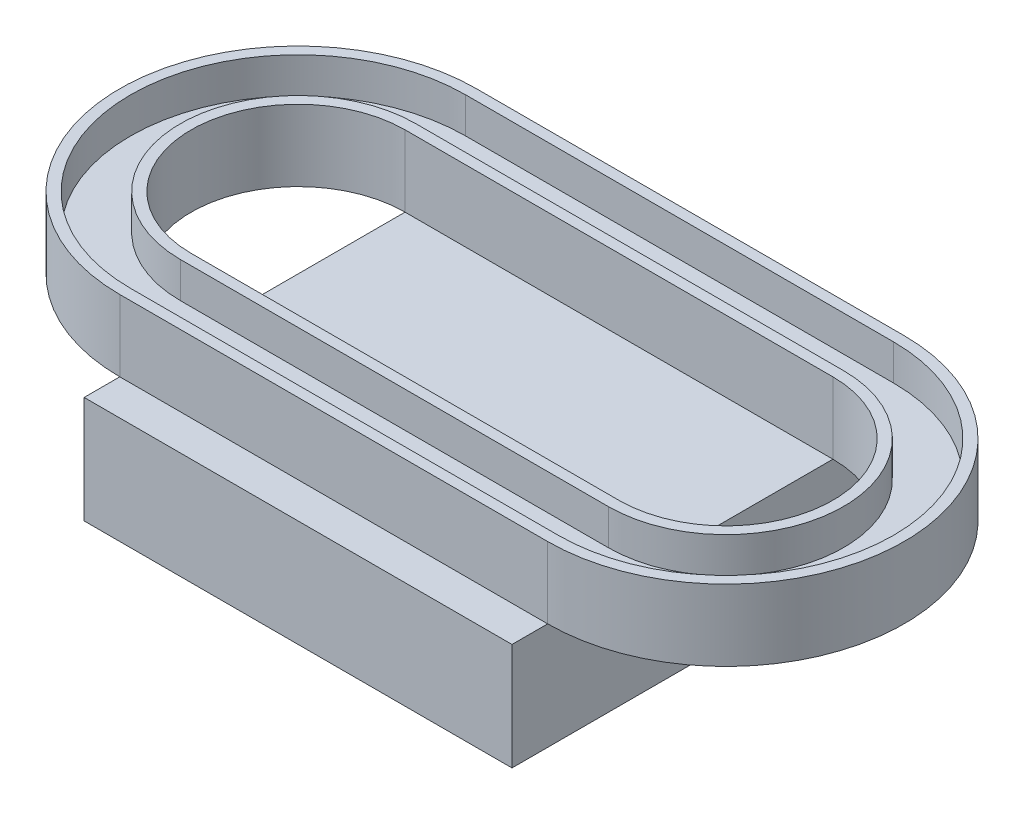
ISO-10303-21;
HEADER;
FILE_DESCRIPTION(('STEP AP214'),'2;1');
FILE_NAME('part.step','',(''),(''),'','','');
FILE_SCHEMA(('AUTOMOTIVE_DESIGN { 1 0 10303 214 1 1 1 1 }'));
ENDSEC;
DATA;
#1=APPLICATION_CONTEXT('core data for automotive mechanical design processes');
#2=APPLICATION_PROTOCOL_DEFINITION('international standard','automotive_design',2000,#1);
#3=PRODUCT_CONTEXT('',#1,'mechanical');
#4=PRODUCT('Part','Part','',(#3));
#5=PRODUCT_RELATED_PRODUCT_CATEGORY('part','',(#4));
#6=PRODUCT_DEFINITION_FORMATION('','',#4);
#7=PRODUCT_DEFINITION_CONTEXT('part definition',#1,'design');
#8=PRODUCT_DEFINITION('design','',#6,#7);
#9=PRODUCT_DEFINITION_SHAPE('','',#8);
#10=(LENGTH_UNIT() NAMED_UNIT(*) SI_UNIT(.MILLI.,.METRE.));
#11=(NAMED_UNIT(*) PLANE_ANGLE_UNIT() SI_UNIT($,.RADIAN.));
#12=(NAMED_UNIT(*) SI_UNIT($,.STERADIAN.) SOLID_ANGLE_UNIT());
#13=UNCERTAINTY_MEASURE_WITH_UNIT(LENGTH_MEASURE(1.E-05),#10,'distance_accuracy_value','');
#14=(GEOMETRIC_REPRESENTATION_CONTEXT(3) GLOBAL_UNCERTAINTY_ASSIGNED_CONTEXT((#13)) GLOBAL_UNIT_ASSIGNED_CONTEXT((#10,
#11,#12)) REPRESENTATION_CONTEXT('',''));
#15=CARTESIAN_POINT('',(0.,0.,0.));
#16=DIRECTION('',(0.,0.,1.));
#17=DIRECTION('',(1.,0.,0.));
#18=AXIS2_PLACEMENT_3D('',#15,#16,#17);
#19=CARTESIAN_POINT('',(-60.,0.,0.));
#20=DIRECTION('',(0.,1.,0.));
#21=DIRECTION('',(0.,0.,1.));
#22=AXIS2_PLACEMENT_3D('',#19,#20,#21);
#23=PLANE('',#22);
#24=CARTESIAN_POINT('',(60.,0.,0.));
#25=DIRECTION('',(0.,1.,0.));
#26=DIRECTION('',(0.,0.,-1.));
#27=AXIS2_PLACEMENT_3D('',#24,#25,#26);
#28=CIRCLE('',#27,50.);
#29=CARTESIAN_POINT('',(60.,0.,50.));
#30=VERTEX_POINT('',#29);
#31=CARTESIAN_POINT('',(60.,0.,-50.));
#32=VERTEX_POINT('',#31);
#33=EDGE_CURVE('E425',#30,#32,#28,.T.);
#34=ORIENTED_EDGE('',*,*,#33,.F.);
#35=DIRECTION('',(0.,0.,-1.));
#36=VECTOR('',#35,1.);
#37=CARTESIAN_POINT('',(60.,0.,60.));
#38=LINE('',#37,#36);
#39=CARTESIAN_POINT('',(60.,0.,30.));
#40=VERTEX_POINT('',#39);
#41=EDGE_CURVE('E12',#30,#40,#38,.T.);
#42=ORIENTED_EDGE('',*,*,#41,.T.);
#43=CARTESIAN_POINT('',(60.,0.,0.));
#44=DIRECTION('',(0.,1.,0.));
#45=DIRECTION('',(0.,0.,-1.));
#46=AXIS2_PLACEMENT_3D('',#43,#44,#45);
#47=CIRCLE('',#46,30.);
#48=CARTESIAN_POINT('',(60.,0.,-30.));
#49=VERTEX_POINT('',#48);
#50=EDGE_CURVE('E393',#40,#49,#47,.T.);
#51=ORIENTED_EDGE('',*,*,#50,.T.);
#52=EDGE_CURVE('E77',#49,#32,#38,.T.);
#53=ORIENTED_EDGE('',*,*,#52,.T.);
#54=EDGE_LOOP('',(#34,#42,#51,#53));
#55=FACE_BOUND('',#54,.T.);
#56=ADVANCED_FACE('F67',(#55),#23,.F.);
#57=CARTESIAN_POINT('',(-60.,10.,0.));
#58=DIRECTION('',(0.,1.,0.));
#59=DIRECTION('',(0.,0.,1.));
#60=AXIS2_PLACEMENT_3D('',#57,#58,#59);
#61=PLANE('',#60);
#62=CARTESIAN_POINT('',(60.,10.,0.));
#63=DIRECTION('',(0.,1.,0.));
#64=DIRECTION('',(0.,0.,1.));
#65=AXIS2_PLACEMENT_3D('',#62,#63,#64);
#66=CIRCLE('',#65,47.);
#67=CARTESIAN_POINT('',(60.,10.,-47.));
#68=VERTEX_POINT('',#67);
#69=CARTESIAN_POINT('',(60.,10.,47.));
#70=VERTEX_POINT('',#69);
#71=EDGE_CURVE('E323',#68,#70,#66,.F.);
#72=ORIENTED_EDGE('',*,*,#71,.F.);
#73=DIRECTION('',(-1.,0.,0.));
#74=VECTOR('',#73,1.);
#75=CARTESIAN_POINT('',(-60.,10.,-47.));
#76=LINE('',#75,#74);
#77=CARTESIAN_POINT('',(-60.,10.,-47.));
#78=VERTEX_POINT('',#77);
#79=EDGE_CURVE('E313',#68,#78,#76,.T.);
#80=ORIENTED_EDGE('',*,*,#79,.T.);
#81=CARTESIAN_POINT('',(-60.,10.,0.));
#82=DIRECTION('',(0.,1.,0.));
#83=DIRECTION('',(0.,0.,1.));
#84=AXIS2_PLACEMENT_3D('',#81,#82,#83);
#85=CIRCLE('',#84,47.);
#86=CARTESIAN_POINT('',(-60.,10.,47.));
#87=VERTEX_POINT('',#86);
#88=EDGE_CURVE('E317',#87,#78,#85,.F.);
#89=ORIENTED_EDGE('',*,*,#88,.F.);
#90=DIRECTION('',(-1.,0.,0.));
#91=VECTOR('',#90,1.);
#92=CARTESIAN_POINT('',(-60.,10.,47.));
#93=LINE('',#92,#91);
#94=EDGE_CURVE('E320',#70,#87,#93,.T.);
#95=ORIENTED_EDGE('',*,*,#94,.F.);
#96=EDGE_LOOP('',(#72,#80,#89,#95));
#97=FACE_BOUND('',#96,.T.);
#98=DIRECTION('',(-1.,0.,0.));
#99=VECTOR('',#98,1.);
#100=CARTESIAN_POINT('',(-60.,10.,-33.));
#101=LINE('',#100,#99);
#102=CARTESIAN_POINT('',(60.,10.,-33.));
#103=VERTEX_POINT('',#102);
#104=CARTESIAN_POINT('',(-60.,10.,-33.));
#105=VERTEX_POINT('',#104);
#106=EDGE_CURVE('E383',#103,#105,#101,.T.);
#107=ORIENTED_EDGE('',*,*,#106,.F.);
#108=CARTESIAN_POINT('',(60.,10.,0.));
#109=DIRECTION('',(0.,1.,0.));
#110=DIRECTION('',(0.,0.,1.));
#111=AXIS2_PLACEMENT_3D('',#108,#109,#110);
#112=CIRCLE('',#111,33.);
#113=CARTESIAN_POINT('',(60.,10.,33.));
#114=VERTEX_POINT('',#113);
#115=EDGE_CURVE('E371',#103,#114,#112,.F.);
#116=ORIENTED_EDGE('',*,*,#115,.T.);
#117=DIRECTION('',(-1.,0.,0.));
#118=VECTOR('',#117,1.);
#119=CARTESIAN_POINT('',(-60.,10.,33.));
#120=LINE('',#119,#118);
#121=CARTESIAN_POINT('',(-60.,10.,33.));
#122=VERTEX_POINT('',#121);
#123=EDGE_CURVE('E375',#114,#122,#120,.T.);
#124=ORIENTED_EDGE('',*,*,#123,.T.);
#125=CARTESIAN_POINT('',(-60.,10.,0.));
#126=DIRECTION('',(0.,1.,0.));
#127=DIRECTION('',(0.,0.,1.));
#128=AXIS2_PLACEMENT_3D('',#125,#126,#127);
#129=CIRCLE('',#128,33.);
#130=EDGE_CURVE('E379',#122,#105,#129,.F.);
#131=ORIENTED_EDGE('',*,*,#130,.T.);
#132=EDGE_LOOP('',(#107,#116,#124,#131));
#133=FACE_BOUND('',#132,.T.);
#134=ADVANCED_FACE('F484',(#97,#133),#61,.T.);
#135=CARTESIAN_POINT('',(-60.,0.,0.));
#136=DIRECTION('',(0.,1.,0.));
#137=DIRECTION('',(0.,0.,1.));
#138=AXIS2_PLACEMENT_3D('',#135,#136,#137);
#139=CIRCLE('',#138,50.);
#140=CARTESIAN_POINT('',(-60.,0.,-50.));
#141=VERTEX_POINT('',#140);
#142=CARTESIAN_POINT('',(-60.,0.,50.));
#143=VERTEX_POINT('',#142);
#144=EDGE_CURVE('E417',#141,#143,#139,.T.);
#145=ORIENTED_EDGE('',*,*,#144,.F.);
#146=DIRECTION('',(0.,0.,1.));
#147=VECTOR('',#146,1.);
#148=CARTESIAN_POINT('',(-60.,0.,60.));
#149=LINE('',#148,#147);
#150=CARTESIAN_POINT('',(-60.,0.,-30.));
#151=VERTEX_POINT('',#150);
#152=EDGE_CURVE('E452',#141,#151,#149,.T.);
#153=ORIENTED_EDGE('',*,*,#152,.T.);
#154=CARTESIAN_POINT('',(-60.,0.,0.));
#155=DIRECTION('',(0.,1.,0.));
#156=DIRECTION('',(0.,0.,1.));
#157=AXIS2_PLACEMENT_3D('',#154,#155,#156);
#158=CIRCLE('',#157,30.);
#159=CARTESIAN_POINT('',(-60.,0.,30.));
#160=VERTEX_POINT('',#159);
#161=EDGE_CURVE('E386',#151,#160,#158,.T.);
#162=ORIENTED_EDGE('',*,*,#161,.T.);
#163=EDGE_CURVE('E258',#160,#143,#149,.T.);
#164=ORIENTED_EDGE('',*,*,#163,.T.);
#165=EDGE_LOOP('',(#145,#153,#162,#164));
#166=FACE_BOUND('',#165,.T.);
#167=ADVANCED_FACE('F482',(#166),#23,.F.);
#168=CARTESIAN_POINT('',(-60.,10.,0.));
#169=DIRECTION('',(0.,-1.,0.));
#170=DIRECTION('',(0.,0.,-1.));
#171=AXIS2_PLACEMENT_3D('',#168,#169,#170);
#172=CYLINDRICAL_SURFACE('',#171,50.);
#173=ORIENTED_EDGE('',*,*,#144,.T.);
#174=DIRECTION('',(0.,-1.,0.));
#175=VECTOR('',#174,1.);
#176=CARTESIAN_POINT('',(-60.,10.,50.));
#177=LINE('',#176,#175);
#178=CARTESIAN_POINT('',(-60.,20.,50.));
#179=VERTEX_POINT('',#178);
#180=EDGE_CURVE('E71',#179,#143,#177,.T.);
#181=ORIENTED_EDGE('',*,*,#180,.F.);
#182=CARTESIAN_POINT('',(-60.,20.,0.));
#183=DIRECTION('',(0.,1.,0.));
#184=DIRECTION('',(0.,0.,1.));
#185=AXIS2_PLACEMENT_3D('',#182,#183,#184);
#186=CIRCLE('',#185,50.);
#187=CARTESIAN_POINT('',(-60.,20.,-50.));
#188=VERTEX_POINT('',#187);
#189=EDGE_CURVE('E287',#188,#179,#186,.T.);
#190=ORIENTED_EDGE('',*,*,#189,.F.);
#191=DIRECTION('',(0.,-1.,0.));
#192=VECTOR('',#191,1.);
#193=CARTESIAN_POINT('',(-60.,10.,-50.));
#194=LINE('',#193,#192);
#195=EDGE_CURVE('E433',#188,#141,#194,.T.);
#196=ORIENTED_EDGE('',*,*,#195,.T.);
#197=EDGE_LOOP('',(#173,#181,#190,#196));
#198=FACE_BOUND('',#197,.T.);
#199=ADVANCED_FACE('F69',(#198),#172,.T.);
#200=CARTESIAN_POINT('',(-60.,10.,50.));
#201=DIRECTION('',(0.,0.,-1.));
#202=DIRECTION('',(-1.,0.,0.));
#203=AXIS2_PLACEMENT_3D('',#200,#201,#202);
#204=PLANE('',#203);
#205=DIRECTION('',(1.,0.,0.));
#206=VECTOR('',#205,1.);
#207=CARTESIAN_POINT('',(-60.,0.,50.));
#208=LINE('',#207,#206);
#209=EDGE_CURVE('E421',#143,#30,#208,.T.);
#210=ORIENTED_EDGE('',*,*,#209,.T.);
#211=DIRECTION('',(0.,-1.,0.));
#212=VECTOR('',#211,1.);
#213=CARTESIAN_POINT('',(60.,10.,50.));
#214=LINE('',#213,#212);
#215=CARTESIAN_POINT('',(60.,20.,50.));
#216=VERTEX_POINT('',#215);
#217=EDGE_CURVE('E440',#216,#30,#214,.T.);
#218=ORIENTED_EDGE('',*,*,#217,.F.);
#219=DIRECTION('',(1.,0.,0.));
#220=VECTOR('',#219,1.);
#221=CARTESIAN_POINT('',(0.,20.,50.));
#222=LINE('',#221,#220);
#223=EDGE_CURVE('E291',#179,#216,#222,.T.);
#224=ORIENTED_EDGE('',*,*,#223,.F.);
#225=ORIENTED_EDGE('',*,*,#180,.T.);
#226=EDGE_LOOP('',(#210,#218,#224,#225));
#227=FACE_BOUND('',#226,.T.);
#228=ADVANCED_FACE('F475',(#227),#204,.F.);
#229=CARTESIAN_POINT('',(60.,10.,0.));
#230=DIRECTION('',(0.,-1.,0.));
#231=DIRECTION('',(0.,0.,-1.));
#232=AXIS2_PLACEMENT_3D('',#229,#230,#231);
#233=CYLINDRICAL_SURFACE('',#232,50.);
#234=ORIENTED_EDGE('',*,*,#33,.T.);
#235=DIRECTION('',(0.,-1.,0.));
#236=VECTOR('',#235,1.);
#237=CARTESIAN_POINT('',(60.,10.,-50.));
#238=LINE('',#237,#236);
#239=CARTESIAN_POINT('',(60.,20.,-50.));
#240=VERTEX_POINT('',#239);
#241=EDGE_CURVE('E437',#240,#32,#238,.T.);
#242=ORIENTED_EDGE('',*,*,#241,.F.);
#243=CARTESIAN_POINT('',(60.,20.,0.));
#244=DIRECTION('',(0.,1.,0.));
#245=DIRECTION('',(0.,0.,1.));
#246=AXIS2_PLACEMENT_3D('',#243,#244,#245);
#247=CIRCLE('',#246,50.);
#248=EDGE_CURVE('E295',#216,#240,#247,.T.);
#249=ORIENTED_EDGE('',*,*,#248,.F.);
#250=ORIENTED_EDGE('',*,*,#217,.T.);
#251=EDGE_LOOP('',(#234,#242,#249,#250));
#252=FACE_BOUND('',#251,.T.);
#253=ADVANCED_FACE('F476',(#252),#233,.T.);
#254=CARTESIAN_POINT('',(-60.,10.,-50.));
#255=DIRECTION('',(0.,0.,1.));
#256=DIRECTION('',(1.,0.,0.));
#257=AXIS2_PLACEMENT_3D('',#254,#255,#256);
#258=PLANE('',#257);
#259=DIRECTION('',(-1.,0.,0.));
#260=VECTOR('',#259,1.);
#261=CARTESIAN_POINT('',(-60.,0.,-50.));
#262=LINE('',#261,#260);
#263=EDGE_CURVE('E429',#32,#141,#262,.T.);
#264=ORIENTED_EDGE('',*,*,#263,.T.);
#265=ORIENTED_EDGE('',*,*,#195,.F.);
#266=DIRECTION('',(1.,0.,0.));
#267=VECTOR('',#266,1.);
#268=CARTESIAN_POINT('',(0.,20.,-50.));
#269=LINE('',#268,#267);
#270=EDGE_CURVE('E283',#188,#240,#269,.T.);
#271=ORIENTED_EDGE('',*,*,#270,.T.);
#272=ORIENTED_EDGE('',*,*,#241,.T.);
#273=EDGE_LOOP('',(#264,#265,#271,#272));
#274=FACE_BOUND('',#273,.T.);
#275=ADVANCED_FACE('F499',(#274),#258,.F.);
#276=CARTESIAN_POINT('',(-60.,10.,0.));
#277=DIRECTION('',(0.,-1.,0.));
#278=DIRECTION('',(0.,0.,-1.));
#279=AXIS2_PLACEMENT_3D('',#276,#277,#278);
#280=CYLINDRICAL_SURFACE('',#279,30.);
#281=ORIENTED_EDGE('',*,*,#161,.F.);
#282=DIRECTION('',(0.,-1.,0.));
#283=VECTOR('',#282,1.);
#284=CARTESIAN_POINT('',(-60.,10.,-30.));
#285=LINE('',#284,#283);
#286=CARTESIAN_POINT('',(-60.,20.,-30.));
#287=VERTEX_POINT('',#286);
#288=EDGE_CURVE('E401',#287,#151,#285,.T.);
#289=ORIENTED_EDGE('',*,*,#288,.F.);
#290=CARTESIAN_POINT('',(-60.,20.,0.));
#291=DIRECTION('',(0.,1.,0.));
#292=DIRECTION('',(0.,0.,1.));
#293=AXIS2_PLACEMENT_3D('',#290,#291,#292);
#294=CIRCLE('',#293,30.);
#295=CARTESIAN_POINT('',(-60.,20.,30.));
#296=VERTEX_POINT('',#295);
#297=EDGE_CURVE('E326',#287,#296,#294,.T.);
#298=ORIENTED_EDGE('',*,*,#297,.T.);
#299=DIRECTION('',(0.,-1.,0.));
#300=VECTOR('',#299,1.);
#301=CARTESIAN_POINT('',(-60.,10.,30.));
#302=LINE('',#301,#300);
#303=EDGE_CURVE('E413',#296,#160,#302,.T.);
#304=ORIENTED_EDGE('',*,*,#303,.T.);
#305=EDGE_LOOP('',(#281,#289,#298,#304));
#306=FACE_BOUND('',#305,.T.);
#307=ADVANCED_FACE('F516',(#306),#280,.F.);
#308=CARTESIAN_POINT('',(-60.,10.,30.));
#309=DIRECTION('',(0.,0.,-1.));
#310=DIRECTION('',(-1.,0.,0.));
#311=AXIS2_PLACEMENT_3D('',#308,#309,#310);
#312=PLANE('',#311);
#313=DIRECTION('',(1.,0.,0.));
#314=VECTOR('',#313,1.);
#315=CARTESIAN_POINT('',(-60.,0.,30.));
#316=LINE('',#315,#314);
#317=EDGE_CURVE('E390',#160,#40,#316,.T.);
#318=ORIENTED_EDGE('',*,*,#317,.F.);
#319=ORIENTED_EDGE('',*,*,#303,.F.);
#320=DIRECTION('',(1.,0.,0.));
#321=VECTOR('',#320,1.);
#322=CARTESIAN_POINT('',(0.,20.,30.));
#323=LINE('',#322,#321);
#324=CARTESIAN_POINT('',(60.,20.,30.));
#325=VERTEX_POINT('',#324);
#326=EDGE_CURVE('E338',#296,#325,#323,.T.);
#327=ORIENTED_EDGE('',*,*,#326,.T.);
#328=DIRECTION('',(0.,-1.,0.));
#329=VECTOR('',#328,1.);
#330=CARTESIAN_POINT('',(60.,10.,30.));
#331=LINE('',#330,#329);
#332=EDGE_CURVE('E409',#325,#40,#331,.T.);
#333=ORIENTED_EDGE('',*,*,#332,.T.);
#334=EDGE_LOOP('',(#318,#319,#327,#333));
#335=FACE_BOUND('',#334,.T.);
#336=ADVANCED_FACE('F519',(#335),#312,.T.);
#337=CARTESIAN_POINT('',(60.,10.,0.));
#338=DIRECTION('',(0.,-1.,0.));
#339=DIRECTION('',(0.,0.,-1.));
#340=AXIS2_PLACEMENT_3D('',#337,#338,#339);
#341=CYLINDRICAL_SURFACE('',#340,30.);
#342=ORIENTED_EDGE('',*,*,#50,.F.);
#343=ORIENTED_EDGE('',*,*,#332,.F.);
#344=CARTESIAN_POINT('',(60.,20.,0.));
#345=DIRECTION('',(0.,1.,0.));
#346=DIRECTION('',(0.,0.,1.));
#347=AXIS2_PLACEMENT_3D('',#344,#345,#346);
#348=CIRCLE('',#347,30.);
#349=CARTESIAN_POINT('',(60.,20.,-30.));
#350=VERTEX_POINT('',#349);
#351=EDGE_CURVE('E334',#325,#350,#348,.T.);
#352=ORIENTED_EDGE('',*,*,#351,.T.);
#353=DIRECTION('',(0.,-1.,0.));
#354=VECTOR('',#353,1.);
#355=CARTESIAN_POINT('',(60.,10.,-30.));
#356=LINE('',#355,#354);
#357=EDGE_CURVE('E405',#350,#49,#356,.T.);
#358=ORIENTED_EDGE('',*,*,#357,.T.);
#359=EDGE_LOOP('',(#342,#343,#352,#358));
#360=FACE_BOUND('',#359,.T.);
#361=ADVANCED_FACE('F509',(#360),#341,.F.);
#362=CARTESIAN_POINT('',(-60.,10.,-30.));
#363=DIRECTION('',(0.,0.,1.));
#364=DIRECTION('',(1.,0.,0.));
#365=AXIS2_PLACEMENT_3D('',#362,#363,#364);
#366=PLANE('',#365);
#367=DIRECTION('',(-1.,0.,0.));
#368=VECTOR('',#367,1.);
#369=CARTESIAN_POINT('',(-60.,0.,-30.));
#370=LINE('',#369,#368);
#371=EDGE_CURVE('E397',#49,#151,#370,.T.);
#372=ORIENTED_EDGE('',*,*,#371,.F.);
#373=ORIENTED_EDGE('',*,*,#357,.F.);
#374=DIRECTION('',(1.,0.,0.));
#375=VECTOR('',#374,1.);
#376=CARTESIAN_POINT('',(0.,20.,-30.));
#377=LINE('',#376,#375);
#378=EDGE_CURVE('E330',#287,#350,#377,.T.);
#379=ORIENTED_EDGE('',*,*,#378,.F.);
#380=ORIENTED_EDGE('',*,*,#288,.T.);
#381=EDGE_LOOP('',(#372,#373,#379,#380));
#382=FACE_BOUND('',#381,.T.);
#383=ADVANCED_FACE('F513',(#382),#366,.T.);
#384=CARTESIAN_POINT('',(0.,20.,-33.));
#385=DIRECTION('',(0.,0.,-1.));
#386=DIRECTION('',(-1.,0.,0.));
#387=AXIS2_PLACEMENT_3D('',#384,#385,#386);
#388=PLANE('',#387);
#389=DIRECTION('',(0.,-1.,0.));
#390=VECTOR('',#389,1.);
#391=CARTESIAN_POINT('',(60.,20.,-33.));
#392=LINE('',#391,#390);
#393=CARTESIAN_POINT('',(60.,20.,-33.));
#394=VERTEX_POINT('',#393);
#395=EDGE_CURVE('E357',#394,#103,#392,.T.);
#396=ORIENTED_EDGE('',*,*,#395,.T.);
#397=ORIENTED_EDGE('',*,*,#106,.T.);
#398=DIRECTION('',(0.,-1.,0.));
#399=VECTOR('',#398,1.);
#400=CARTESIAN_POINT('',(-60.,20.,-33.));
#401=LINE('',#400,#399);
#402=CARTESIAN_POINT('',(-60.,20.,-33.));
#403=VERTEX_POINT('',#402);
#404=EDGE_CURVE('E367',#403,#105,#401,.T.);
#405=ORIENTED_EDGE('',*,*,#404,.F.);
#406=DIRECTION('',(1.,0.,0.));
#407=VECTOR('',#406,1.);
#408=CARTESIAN_POINT('',(0.,20.,-33.));
#409=LINE('',#408,#407);
#410=EDGE_CURVE('E342',#403,#394,#409,.T.);
#411=ORIENTED_EDGE('',*,*,#410,.T.);
#412=EDGE_LOOP('',(#396,#397,#405,#411));
#413=FACE_BOUND('',#412,.T.);
#414=ADVANCED_FACE('F532',(#413),#388,.T.);
#415=CARTESIAN_POINT('',(-60.,20.,0.));
#416=DIRECTION('',(0.,-1.,0.));
#417=DIRECTION('',(0.,0.,-1.));
#418=AXIS2_PLACEMENT_3D('',#415,#416,#417);
#419=CYLINDRICAL_SURFACE('',#418,33.);
#420=ORIENTED_EDGE('',*,*,#130,.F.);
#421=DIRECTION('',(0.,-1.,0.));
#422=VECTOR('',#421,1.);
#423=CARTESIAN_POINT('',(-60.,20.,33.));
#424=LINE('',#423,#422);
#425=CARTESIAN_POINT('',(-60.,20.,33.));
#426=VERTEX_POINT('',#425);
#427=EDGE_CURVE('E363',#426,#122,#424,.T.);
#428=ORIENTED_EDGE('',*,*,#427,.F.);
#429=CARTESIAN_POINT('',(-60.,20.,0.));
#430=DIRECTION('',(0.,1.,0.));
#431=DIRECTION('',(0.,0.,1.));
#432=AXIS2_PLACEMENT_3D('',#429,#430,#431);
#433=CIRCLE('',#432,33.);
#434=EDGE_CURVE('E346',#403,#426,#433,.T.);
#435=ORIENTED_EDGE('',*,*,#434,.F.);
#436=ORIENTED_EDGE('',*,*,#404,.T.);
#437=EDGE_LOOP('',(#420,#428,#435,#436));
#438=FACE_BOUND('',#437,.T.);
#439=ADVANCED_FACE('F535',(#438),#419,.T.);
#440=CARTESIAN_POINT('',(0.,20.,33.));
#441=DIRECTION('',(0.,0.,-1.));
#442=DIRECTION('',(-1.,0.,0.));
#443=AXIS2_PLACEMENT_3D('',#440,#441,#442);
#444=PLANE('',#443);
#445=ORIENTED_EDGE('',*,*,#123,.F.);
#446=DIRECTION('',(0.,-1.,0.));
#447=VECTOR('',#446,1.);
#448=CARTESIAN_POINT('',(60.,20.,33.));
#449=LINE('',#448,#447);
#450=CARTESIAN_POINT('',(60.,20.,33.));
#451=VERTEX_POINT('',#450);
#452=EDGE_CURVE('E94',#451,#114,#449,.T.);
#453=ORIENTED_EDGE('',*,*,#452,.F.);
#454=DIRECTION('',(1.,0.,0.));
#455=VECTOR('',#454,1.);
#456=CARTESIAN_POINT('',(0.,20.,33.));
#457=LINE('',#456,#455);
#458=EDGE_CURVE('E350',#426,#451,#457,.T.);
#459=ORIENTED_EDGE('',*,*,#458,.F.);
#460=ORIENTED_EDGE('',*,*,#427,.T.);
#461=EDGE_LOOP('',(#445,#453,#459,#460));
#462=FACE_BOUND('',#461,.T.);
#463=ADVANCED_FACE('F537',(#462),#444,.F.);
#464=CARTESIAN_POINT('',(60.,20.,0.));
#465=DIRECTION('',(0.,-1.,0.));
#466=DIRECTION('',(0.,0.,-1.));
#467=AXIS2_PLACEMENT_3D('',#464,#465,#466);
#468=CYLINDRICAL_SURFACE('',#467,33.);
#469=ORIENTED_EDGE('',*,*,#115,.F.);
#470=ORIENTED_EDGE('',*,*,#395,.F.);
#471=CARTESIAN_POINT('',(60.,20.,0.));
#472=DIRECTION('',(0.,1.,0.));
#473=DIRECTION('',(0.,0.,1.));
#474=AXIS2_PLACEMENT_3D('',#471,#472,#473);
#475=CIRCLE('',#474,33.);
#476=EDGE_CURVE('E354',#451,#394,#475,.T.);
#477=ORIENTED_EDGE('',*,*,#476,.F.);
#478=ORIENTED_EDGE('',*,*,#452,.T.);
#479=EDGE_LOOP('',(#469,#470,#477,#478));
#480=FACE_BOUND('',#479,.T.);
#481=ADVANCED_FACE('F525',(#480),#468,.T.);
#482=CARTESIAN_POINT('',(0.,20.,0.));
#483=DIRECTION('',(0.,1.,0.));
#484=DIRECTION('',(0.,0.,1.));
#485=AXIS2_PLACEMENT_3D('',#482,#483,#484);
#486=PLANE('',#485);
#487=ORIENTED_EDGE('',*,*,#297,.F.);
#488=ORIENTED_EDGE('',*,*,#378,.T.);
#489=ORIENTED_EDGE('',*,*,#351,.F.);
#490=ORIENTED_EDGE('',*,*,#326,.F.);
#491=EDGE_LOOP('',(#487,#488,#489,#490));
#492=FACE_BOUND('',#491,.T.);
#493=ORIENTED_EDGE('',*,*,#410,.F.);
#494=ORIENTED_EDGE('',*,*,#434,.T.);
#495=ORIENTED_EDGE('',*,*,#458,.T.);
#496=ORIENTED_EDGE('',*,*,#476,.T.);
#497=EDGE_LOOP('',(#493,#494,#495,#496));
#498=FACE_BOUND('',#497,.T.);
#499=ADVANCED_FACE('F521',(#492,#498),#486,.T.);
#500=CARTESIAN_POINT('',(60.,20.,0.));
#501=DIRECTION('',(0.,-1.,0.));
#502=DIRECTION('',(0.,0.,-1.));
#503=AXIS2_PLACEMENT_3D('',#500,#501,#502);
#504=CYLINDRICAL_SURFACE('',#503,47.);
#505=DIRECTION('',(0.,-1.,0.));
#506=VECTOR('',#505,1.);
#507=CARTESIAN_POINT('',(60.,20.,-47.));
#508=LINE('',#507,#506);
#509=CARTESIAN_POINT('',(60.,20.,-47.));
#510=VERTEX_POINT('',#509);
#511=EDGE_CURVE('E299',#510,#68,#508,.T.);
#512=ORIENTED_EDGE('',*,*,#511,.T.);
#513=ORIENTED_EDGE('',*,*,#71,.T.);
#514=DIRECTION('',(0.,-1.,0.));
#515=VECTOR('',#514,1.);
#516=CARTESIAN_POINT('',(60.,20.,47.));
#517=LINE('',#516,#515);
#518=CARTESIAN_POINT('',(60.,20.,47.));
#519=VERTEX_POINT('',#518);
#520=EDGE_CURVE('E309',#519,#70,#517,.T.);
#521=ORIENTED_EDGE('',*,*,#520,.F.);
#522=CARTESIAN_POINT('',(60.,20.,0.));
#523=DIRECTION('',(0.,1.,0.));
#524=DIRECTION('',(0.,0.,1.));
#525=AXIS2_PLACEMENT_3D('',#522,#523,#524);
#526=CIRCLE('',#525,47.);
#527=EDGE_CURVE('E262',#519,#510,#526,.T.);
#528=ORIENTED_EDGE('',*,*,#527,.T.);
#529=EDGE_LOOP('',(#512,#513,#521,#528));
#530=FACE_BOUND('',#529,.T.);
#531=ADVANCED_FACE('F524',(#530),#504,.F.);
#532=CARTESIAN_POINT('',(0.,20.,47.));
#533=DIRECTION('',(0.,0.,-1.));
#534=DIRECTION('',(-1.,0.,0.));
#535=AXIS2_PLACEMENT_3D('',#532,#533,#534);
#536=PLANE('',#535);
#537=ORIENTED_EDGE('',*,*,#520,.T.);
#538=ORIENTED_EDGE('',*,*,#94,.T.);
#539=DIRECTION('',(0.,-1.,0.));
#540=VECTOR('',#539,1.);
#541=CARTESIAN_POINT('',(-60.,20.,47.));
#542=LINE('',#541,#540);
#543=CARTESIAN_POINT('',(-60.,20.,47.));
#544=VERTEX_POINT('',#543);
#545=EDGE_CURVE('E305',#544,#87,#542,.T.);
#546=ORIENTED_EDGE('',*,*,#545,.F.);
#547=DIRECTION('',(1.,0.,0.));
#548=VECTOR('',#547,1.);
#549=CARTESIAN_POINT('',(0.,20.,47.));
#550=LINE('',#549,#548);
#551=EDGE_CURVE('E272',#544,#519,#550,.T.);
#552=ORIENTED_EDGE('',*,*,#551,.T.);
#553=EDGE_LOOP('',(#537,#538,#546,#552));
#554=FACE_BOUND('',#553,.T.);
#555=ADVANCED_FACE('F641',(#554),#536,.T.);
#556=CARTESIAN_POINT('',(-60.,20.,0.));
#557=DIRECTION('',(0.,-1.,0.));
#558=DIRECTION('',(0.,0.,-1.));
#559=AXIS2_PLACEMENT_3D('',#556,#557,#558);
#560=CYLINDRICAL_SURFACE('',#559,47.);
#561=ORIENTED_EDGE('',*,*,#545,.T.);
#562=ORIENTED_EDGE('',*,*,#88,.T.);
#563=DIRECTION('',(0.,-1.,0.));
#564=VECTOR('',#563,1.);
#565=CARTESIAN_POINT('',(-60.,20.,-47.));
#566=LINE('',#565,#564);
#567=CARTESIAN_POINT('',(-60.,20.,-47.));
#568=VERTEX_POINT('',#567);
#569=EDGE_CURVE('E86',#568,#78,#566,.T.);
#570=ORIENTED_EDGE('',*,*,#569,.F.);
#571=CARTESIAN_POINT('',(-60.,20.,0.));
#572=DIRECTION('',(0.,1.,0.));
#573=DIRECTION('',(0.,0.,1.));
#574=AXIS2_PLACEMENT_3D('',#571,#572,#573);
#575=CIRCLE('',#574,47.);
#576=EDGE_CURVE('E276',#568,#544,#575,.T.);
#577=ORIENTED_EDGE('',*,*,#576,.T.);
#578=EDGE_LOOP('',(#561,#562,#570,#577));
#579=FACE_BOUND('',#578,.T.);
#580=ADVANCED_FACE('F650',(#579),#560,.F.);
#581=CARTESIAN_POINT('',(0.,20.,-47.));
#582=DIRECTION('',(0.,0.,-1.));
#583=DIRECTION('',(-1.,0.,0.));
#584=AXIS2_PLACEMENT_3D('',#581,#582,#583);
#585=PLANE('',#584);
#586=ORIENTED_EDGE('',*,*,#79,.F.);
#587=ORIENTED_EDGE('',*,*,#511,.F.);
#588=DIRECTION('',(1.,0.,0.));
#589=VECTOR('',#588,1.);
#590=CARTESIAN_POINT('',(0.,20.,-47.));
#591=LINE('',#590,#589);
#592=EDGE_CURVE('E280',#568,#510,#591,.T.);
#593=ORIENTED_EDGE('',*,*,#592,.F.);
#594=ORIENTED_EDGE('',*,*,#569,.T.);
#595=EDGE_LOOP('',(#586,#587,#593,#594));
#596=FACE_BOUND('',#595,.T.);
#597=ADVANCED_FACE('F660',(#596),#585,.F.);
#598=CARTESIAN_POINT('',(0.,20.,0.));
#599=DIRECTION('',(0.,1.,0.));
#600=DIRECTION('',(0.,0.,1.));
#601=AXIS2_PLACEMENT_3D('',#598,#599,#600);
#602=PLANE('',#601);
#603=ORIENTED_EDGE('',*,*,#527,.F.);
#604=ORIENTED_EDGE('',*,*,#551,.F.);
#605=ORIENTED_EDGE('',*,*,#576,.F.);
#606=ORIENTED_EDGE('',*,*,#592,.T.);
#607=EDGE_LOOP('',(#603,#604,#605,#606));
#608=FACE_BOUND('',#607,.T.);
#609=ORIENTED_EDGE('',*,*,#270,.F.);
#610=ORIENTED_EDGE('',*,*,#189,.T.);
#611=ORIENTED_EDGE('',*,*,#223,.T.);
#612=ORIENTED_EDGE('',*,*,#248,.T.);
#613=EDGE_LOOP('',(#609,#610,#611,#612));
#614=FACE_BOUND('',#613,.T.);
#615=ADVANCED_FACE('F479',(#608,#614),#602,.T.);
#616=CARTESIAN_POINT('',(0.,0.,0.));
#617=DIRECTION('',(0.,-1.,0.));
#618=DIRECTION('',(0.,0.,-1.));
#619=AXIS2_PLACEMENT_3D('',#616,#617,#618);
#620=PLANE('',#619);
#621=EDGE_CURVE('E257',#151,#160,#149,.T.);
#622=ORIENTED_EDGE('',*,*,#621,.T.);
#623=ORIENTED_EDGE('',*,*,#317,.T.);
#624=EDGE_CURVE('E79',#40,#49,#38,.T.);
#625=ORIENTED_EDGE('',*,*,#624,.T.);
#626=ORIENTED_EDGE('',*,*,#371,.T.);
#627=EDGE_LOOP('',(#622,#623,#625,#626));
#628=FACE_BOUND('',#627,.T.);
#629=ADVANCED_FACE('F505',(#628),#620,.F.);
#630=ORIENTED_EDGE('',*,*,#263,.F.);
#631=CARTESIAN_POINT('',(60.,0.,-60.));
#632=VERTEX_POINT('',#631);
#633=EDGE_CURVE('E251',#32,#632,#38,.T.);
#634=ORIENTED_EDGE('',*,*,#633,.T.);
#635=DIRECTION('',(-1.,0.,0.));
#636=VECTOR('',#635,1.);
#637=CARTESIAN_POINT('',(-60.,0.,-60.));
#638=LINE('',#637,#636);
#639=CARTESIAN_POINT('',(-60.,0.,-60.));
#640=VERTEX_POINT('',#639);
#641=EDGE_CURVE('E214',#632,#640,#638,.T.);
#642=ORIENTED_EDGE('',*,*,#641,.T.);
#643=EDGE_CURVE('E241',#640,#141,#149,.T.);
#644=ORIENTED_EDGE('',*,*,#643,.T.);
#645=EDGE_LOOP('',(#630,#634,#642,#644));
#646=FACE_BOUND('',#645,.T.);
#647=ADVANCED_FACE('F501',(#646),#620,.F.);
#648=CARTESIAN_POINT('',(60.,-30.,60.));
#649=DIRECTION('',(1.,0.,0.));
#650=DIRECTION('',(0.,0.,-1.));
#651=AXIS2_PLACEMENT_3D('',#648,#649,#650);
#652=PLANE('',#651);
#653=CARTESIAN_POINT('',(60.,0.,60.));
#654=VERTEX_POINT('',#653);
#655=EDGE_CURVE('E247',#654,#30,#38,.T.);
#656=ORIENTED_EDGE('',*,*,#655,.F.);
#657=DIRECTION('',(0.,1.,0.));
#658=VECTOR('',#657,1.);
#659=CARTESIAN_POINT('',(60.,-30.,60.));
#660=LINE('',#659,#658);
#661=CARTESIAN_POINT('',(60.,-30.,60.));
#662=VERTEX_POINT('',#661);
#663=EDGE_CURVE('E235',#662,#654,#660,.T.);
#664=ORIENTED_EDGE('',*,*,#663,.F.);
#665=DIRECTION('',(0.,0.,-1.));
#666=VECTOR('',#665,1.);
#667=CARTESIAN_POINT('',(60.,-30.,60.));
#668=LINE('',#667,#666);
#669=CARTESIAN_POINT('',(60.,-30.,-60.));
#670=VERTEX_POINT('',#669);
#671=EDGE_CURVE('E227',#662,#670,#668,.T.);
#672=ORIENTED_EDGE('',*,*,#671,.T.);
#673=DIRECTION('',(0.,1.,0.));
#674=VECTOR('',#673,1.);
#675=CARTESIAN_POINT('',(60.,-30.,-60.));
#676=LINE('',#675,#674);
#677=EDGE_CURVE('E209',#670,#632,#676,.T.);
#678=ORIENTED_EDGE('',*,*,#677,.T.);
#679=ORIENTED_EDGE('',*,*,#633,.F.);
#680=ORIENTED_EDGE('',*,*,#52,.F.);
#681=ORIENTED_EDGE('',*,*,#624,.F.);
#682=ORIENTED_EDGE('',*,*,#41,.F.);
#683=EDGE_LOOP('',(#656,#664,#672,#678,#679,#680,#681,#682));
#684=FACE_BOUND('',#683,.T.);
#685=ADVANCED_FACE('F234',(#684),#652,.T.);
#686=CARTESIAN_POINT('',(-60.,-30.,60.));
#687=DIRECTION('',(0.,0.,1.));
#688=DIRECTION('',(1.,0.,0.));
#689=AXIS2_PLACEMENT_3D('',#686,#687,#688);
#690=PLANE('',#689);
#691=DIRECTION('',(1.,0.,0.));
#692=VECTOR('',#691,1.);
#693=CARTESIAN_POINT('',(-60.,0.,60.));
#694=LINE('',#693,#692);
#695=CARTESIAN_POINT('',(-60.,0.,60.));
#696=VERTEX_POINT('',#695);
#697=EDGE_CURVE('E237',#696,#654,#694,.T.);
#698=ORIENTED_EDGE('',*,*,#697,.F.);
#699=DIRECTION('',(0.,1.,0.));
#700=VECTOR('',#699,1.);
#701=CARTESIAN_POINT('',(-60.,-30.,60.));
#702=LINE('',#701,#700);
#703=CARTESIAN_POINT('',(-60.,-30.,60.));
#704=VERTEX_POINT('',#703);
#705=EDGE_CURVE('E263',#704,#696,#702,.T.);
#706=ORIENTED_EDGE('',*,*,#705,.F.);
#707=DIRECTION('',(1.,0.,0.));
#708=VECTOR('',#707,1.);
#709=CARTESIAN_POINT('',(-60.,-30.,60.));
#710=LINE('',#709,#708);
#711=EDGE_CURVE('E220',#704,#662,#710,.T.);
#712=ORIENTED_EDGE('',*,*,#711,.T.);
#713=ORIENTED_EDGE('',*,*,#663,.T.);
#714=EDGE_LOOP('',(#698,#706,#712,#713));
#715=FACE_BOUND('',#714,.T.);
#716=ADVANCED_FACE('F473',(#715),#690,.T.);
#717=CARTESIAN_POINT('',(-60.,-30.,60.));
#718=DIRECTION('',(-1.,0.,0.));
#719=DIRECTION('',(0.,0.,1.));
#720=AXIS2_PLACEMENT_3D('',#717,#718,#719);
#721=PLANE('',#720);
#722=ORIENTED_EDGE('',*,*,#643,.F.);
#723=DIRECTION('',(0.,1.,0.));
#724=VECTOR('',#723,1.);
#725=CARTESIAN_POINT('',(-60.,-30.,-60.));
#726=LINE('',#725,#724);
#727=CARTESIAN_POINT('',(-60.,-30.,-60.));
#728=VERTEX_POINT('',#727);
#729=EDGE_CURVE('E219',#728,#640,#726,.T.);
#730=ORIENTED_EDGE('',*,*,#729,.F.);
#731=DIRECTION('',(0.,0.,1.));
#732=VECTOR('',#731,1.);
#733=CARTESIAN_POINT('',(-60.,-30.,60.));
#734=LINE('',#733,#732);
#735=EDGE_CURVE('E230',#728,#704,#734,.T.);
#736=ORIENTED_EDGE('',*,*,#735,.T.);
#737=ORIENTED_EDGE('',*,*,#705,.T.);
#738=EDGE_CURVE('E254',#143,#696,#149,.T.);
#739=ORIENTED_EDGE('',*,*,#738,.F.);
#740=ORIENTED_EDGE('',*,*,#163,.F.);
#741=ORIENTED_EDGE('',*,*,#621,.F.);
#742=ORIENTED_EDGE('',*,*,#152,.F.);
#743=EDGE_LOOP('',(#722,#730,#736,#737,#739,#740,#741,#742));
#744=FACE_BOUND('',#743,.T.);
#745=ADVANCED_FACE('F471',(#744),#721,.T.);
#746=CARTESIAN_POINT('',(-60.,-30.,-60.));
#747=DIRECTION('',(0.,0.,-1.));
#748=DIRECTION('',(-1.,0.,0.));
#749=AXIS2_PLACEMENT_3D('',#746,#747,#748);
#750=PLANE('',#749);
#751=ORIENTED_EDGE('',*,*,#641,.F.);
#752=ORIENTED_EDGE('',*,*,#677,.F.);
#753=DIRECTION('',(-1.,0.,0.));
#754=VECTOR('',#753,1.);
#755=CARTESIAN_POINT('',(-60.,-30.,-60.));
#756=LINE('',#755,#754);
#757=EDGE_CURVE('E212',#670,#728,#756,.T.);
#758=ORIENTED_EDGE('',*,*,#757,.T.);
#759=ORIENTED_EDGE('',*,*,#729,.T.);
#760=EDGE_LOOP('',(#751,#752,#758,#759));
#761=FACE_BOUND('',#760,.T.);
#762=ADVANCED_FACE('F211',(#761),#750,.T.);
#763=CARTESIAN_POINT('',(0.,-30.,0.));
#764=DIRECTION('',(0.,-1.,0.));
#765=DIRECTION('',(0.,0.,-1.));
#766=AXIS2_PLACEMENT_3D('',#763,#764,#765);
#767=PLANE('',#766);
#768=ORIENTED_EDGE('',*,*,#671,.F.);
#769=ORIENTED_EDGE('',*,*,#711,.F.);
#770=ORIENTED_EDGE('',*,*,#735,.F.);
#771=ORIENTED_EDGE('',*,*,#757,.F.);
#772=EDGE_LOOP('',(#768,#769,#770,#771));
#773=FACE_BOUND('',#772,.T.);
#774=ADVANCED_FACE('F225',(#773),#767,.T.);
#775=ORIENTED_EDGE('',*,*,#209,.F.);
#776=ORIENTED_EDGE('',*,*,#738,.T.);
#777=ORIENTED_EDGE('',*,*,#697,.T.);
#778=ORIENTED_EDGE('',*,*,#655,.T.);
#779=EDGE_LOOP('',(#775,#776,#777,#778));
#780=FACE_BOUND('',#779,.T.);
#781=ADVANCED_FACE('F467',(#780),#620,.F.);
#782=CLOSED_SHELL('',(#56,#134,#167,#199,#228,#253,#275,#307,#336,#361,#383,#414,#439,#463,#481,
#499,#531,#555,#580,#597,#615,#629,#647,#685,#716,#745,#762,#774,#781));
#783=MANIFOLD_SOLID_BREP('B2',#782);
#784=ADVANCED_BREP_SHAPE_REPRESENTATION('',(#18,#783),#14);
#785=SHAPE_DEFINITION_REPRESENTATION(#9,#784);
ENDSEC;
END-ISO-10303-21;
